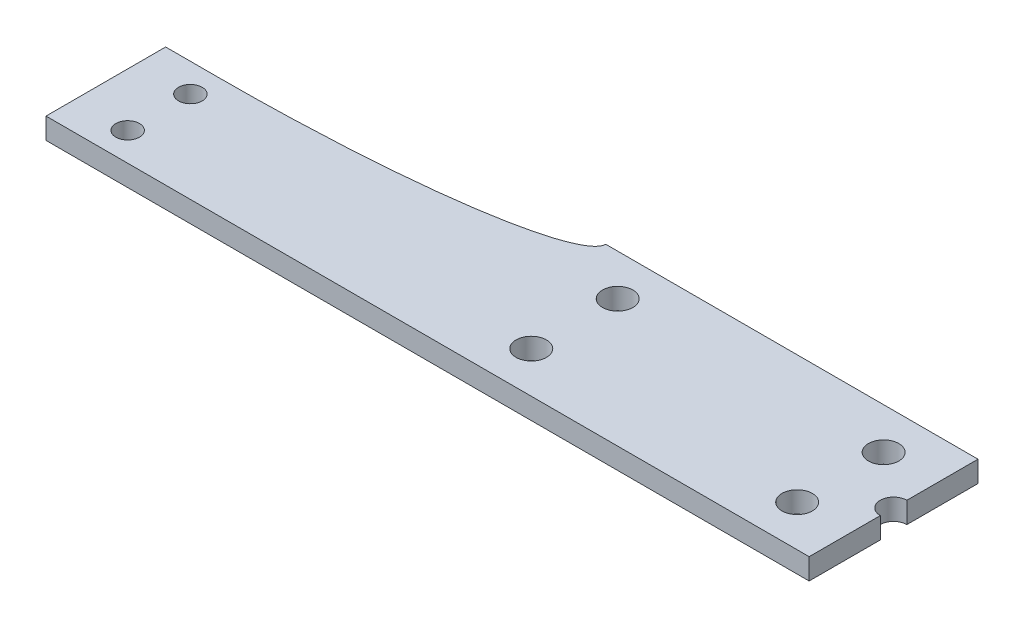
ISO-10303-21;
HEADER;
FILE_DESCRIPTION(('STEP AP214'),'2;1');
FILE_NAME('part.step','',(''),(''),'','','');
FILE_SCHEMA(('AUTOMOTIVE_DESIGN { 1 0 10303 214 1 1 1 1 }'));
ENDSEC;
DATA;
#1=APPLICATION_CONTEXT('core data for automotive mechanical design processes');
#2=APPLICATION_PROTOCOL_DEFINITION('international standard','automotive_design',2000,#1);
#3=PRODUCT_CONTEXT('',#1,'mechanical');
#4=PRODUCT('Part','Part','',(#3));
#5=PRODUCT_RELATED_PRODUCT_CATEGORY('part','',(#4));
#6=PRODUCT_DEFINITION_FORMATION('','',#4);
#7=PRODUCT_DEFINITION_CONTEXT('part definition',#1,'design');
#8=PRODUCT_DEFINITION('design','',#6,#7);
#9=PRODUCT_DEFINITION_SHAPE('','',#8);
#10=(LENGTH_UNIT() NAMED_UNIT(*) SI_UNIT(.MILLI.,.METRE.));
#11=(NAMED_UNIT(*) PLANE_ANGLE_UNIT() SI_UNIT($,.RADIAN.));
#12=(NAMED_UNIT(*) SI_UNIT($,.STERADIAN.) SOLID_ANGLE_UNIT());
#13=UNCERTAINTY_MEASURE_WITH_UNIT(LENGTH_MEASURE(1.E-05),#10,'distance_accuracy_value','');
#14=(GEOMETRIC_REPRESENTATION_CONTEXT(3) GLOBAL_UNCERTAINTY_ASSIGNED_CONTEXT((#13)) GLOBAL_UNIT_ASSIGNED_CONTEXT((#10,
#11,#12)) REPRESENTATION_CONTEXT('',''));
#15=CARTESIAN_POINT('',(0.,0.,0.));
#16=DIRECTION('',(0.,0.,1.));
#17=DIRECTION('',(1.,0.,0.));
#18=AXIS2_PLACEMENT_3D('',#15,#16,#17);
#19=CARTESIAN_POINT('',(-26.7,1.5875,-6.35));
#20=DIRECTION('',(0.,1.,0.));
#21=DIRECTION('',(0.,0.,1.));
#22=AXIS2_PLACEMENT_3D('',#19,#20,#21);
#23=PLANE('',#22);
#24=CARTESIAN_POINT('',(22.7,1.5875,-3.25));
#25=DIRECTION('',(0.,1.,0.));
#26=DIRECTION('',(0.,0.,1.));
#27=AXIS2_PLACEMENT_3D('',#24,#25,#26);
#28=CIRCLE('',#27,1.143);
#29=CARTESIAN_POINT('',(22.7,1.5875,-2.107));
#30=VERTEX_POINT('',#29);
#31=EDGE_CURVE('E338',#30,#30,#28,.T.);
#32=ORIENTED_EDGE('',*,*,#31,.F.);
#33=EDGE_LOOP('',(#32));
#34=FACE_BOUND('',#33,.T.);
#35=CARTESIAN_POINT('',(2.70000000000001,1.5875,-3.25));
#36=DIRECTION('',(0.,1.,0.));
#37=DIRECTION('',(0.,0.,1.));
#38=AXIS2_PLACEMENT_3D('',#35,#36,#37);
#39=CIRCLE('',#38,1.143);
#40=CARTESIAN_POINT('',(2.70000000000001,1.5875,-2.107));
#41=VERTEX_POINT('',#40);
#42=EDGE_CURVE('E350',#41,#41,#39,.T.);
#43=ORIENTED_EDGE('',*,*,#42,.F.);
#44=EDGE_LOOP('',(#43));
#45=FACE_BOUND('',#44,.T.);
#46=CARTESIAN_POINT('',(-26.7,1.5875,-0.509999999999998));
#47=DIRECTION('',(0.,1.,0.));
#48=DIRECTION('',(0.,0.,1.));
#49=AXIS2_PLACEMENT_3D('',#46,#47,#48);
#50=CIRCLE('',#49,0.89);
#51=CARTESIAN_POINT('',(-26.7,1.5875,0.380000000000002));
#52=VERTEX_POINT('',#51);
#53=EDGE_CURVE('E133',#52,#52,#50,.T.);
#54=ORIENTED_EDGE('',*,*,#53,.F.);
#55=EDGE_LOOP('',(#54));
#56=FACE_BOUND('',#55,.T.);
#57=DIRECTION('',(0.,0.,-1.));
#58=VECTOR('',#57,1.);
#59=CARTESIAN_POINT('',(26.7,1.5875,-0.999999999999999));
#60=LINE('',#59,#58);
#61=CARTESIAN_POINT('',(26.7,1.5875,-0.999999999999999));
#62=VERTEX_POINT('',#61);
#63=CARTESIAN_POINT('',(26.7,1.5875,-6.35));
#64=VERTEX_POINT('',#63);
#65=EDGE_CURVE('E145',#62,#64,#60,.T.);
#66=ORIENTED_EDGE('',*,*,#65,.T.);
#67=DIRECTION('',(-1.,0.,0.));
#68=VECTOR('',#67,1.);
#69=CARTESIAN_POINT('',(26.7,1.5875,-6.35));
#70=LINE('',#69,#68);
#71=CARTESIAN_POINT('',(-1.3,1.5875,-6.35));
#72=VERTEX_POINT('',#71);
#73=EDGE_CURVE('E93',#64,#72,#70,.T.);
#74=ORIENTED_EDGE('',*,*,#73,.T.);
#75=CARTESIAN_POINT('',(-26.7,1.5875,-6.35));
#76=DIRECTION('',(0.,-1.,0.));
#77=DIRECTION('',(1.,0.,0.));
#78=AXIS2_PLACEMENT_3D('',#75,#76,#77);
#79=ELLIPSE('',#78,25.4,3.7);
#80=CARTESIAN_POINT('',(-26.7,1.5875,-2.65));
#81=VERTEX_POINT('',#80);
#82=EDGE_CURVE('E160',#72,#81,#79,.T.);
#83=ORIENTED_EDGE('',*,*,#82,.T.);
#84=DIRECTION('',(-1.,0.,0.));
#85=VECTOR('',#84,1.);
#86=CARTESIAN_POINT('',(-30.7,1.5875,-2.65));
#87=LINE('',#86,#85);
#88=CARTESIAN_POINT('',(-30.7,1.5875,-2.65));
#89=VERTEX_POINT('',#88);
#90=EDGE_CURVE('E173',#81,#89,#87,.T.);
#91=ORIENTED_EDGE('',*,*,#90,.T.);
#92=DIRECTION('',(0.,0.,1.));
#93=VECTOR('',#92,1.);
#94=CARTESIAN_POINT('',(-30.7,1.5875,6.35));
#95=LINE('',#94,#93);
#96=CARTESIAN_POINT('',(-30.7,1.5875,6.35));
#97=VERTEX_POINT('',#96);
#98=EDGE_CURVE('E112',#89,#97,#95,.T.);
#99=ORIENTED_EDGE('',*,*,#98,.T.);
#100=DIRECTION('',(1.,0.,0.));
#101=VECTOR('',#100,1.);
#102=CARTESIAN_POINT('',(-26.7,1.5875,6.35));
#103=LINE('',#102,#101);
#104=CARTESIAN_POINT('',(26.7,1.5875,6.35));
#105=VERTEX_POINT('',#104);
#106=EDGE_CURVE('E106',#97,#105,#103,.T.);
#107=ORIENTED_EDGE('',*,*,#106,.T.);
#108=DIRECTION('',(0.,0.,-1.));
#109=VECTOR('',#108,1.);
#110=CARTESIAN_POINT('',(26.7,1.5875,6.35));
#111=LINE('',#110,#109);
#112=CARTESIAN_POINT('',(26.7,1.5875,1.));
#113=VERTEX_POINT('',#112);
#114=EDGE_CURVE('E110',#105,#113,#111,.T.);
#115=ORIENTED_EDGE('',*,*,#114,.T.);
#116=CARTESIAN_POINT('',(26.7,1.5875,0.));
#117=DIRECTION('',(0.,-1.,0.));
#118=DIRECTION('',(0.,0.,1.));
#119=AXIS2_PLACEMENT_3D('',#116,#117,#118);
#120=CIRCLE('',#119,1.);
#121=EDGE_CURVE('E50',#113,#62,#120,.T.);
#122=ORIENTED_EDGE('',*,*,#121,.T.);
#123=EDGE_LOOP('',(#66,#74,#83,#91,#99,#107,#115,#122));
#124=FACE_BOUND('',#123,.T.);
#125=CARTESIAN_POINT('',(-26.7,1.5875,4.21));
#126=DIRECTION('',(0.,1.,0.));
#127=DIRECTION('',(0.,0.,1.));
#128=AXIS2_PLACEMENT_3D('',#125,#126,#127);
#129=CIRCLE('',#128,0.89);
#130=CARTESIAN_POINT('',(-26.7,1.5875,5.1));
#131=VERTEX_POINT('',#130);
#132=EDGE_CURVE('E356',#131,#131,#129,.T.);
#133=ORIENTED_EDGE('',*,*,#132,.F.);
#134=EDGE_LOOP('',(#133));
#135=FACE_BOUND('',#134,.T.);
#136=CARTESIAN_POINT('',(2.70000000000001,1.5875,3.25));
#137=DIRECTION('',(0.,1.,0.));
#138=DIRECTION('',(0.,0.,1.));
#139=AXIS2_PLACEMENT_3D('',#136,#137,#138);
#140=CIRCLE('',#139,1.143);
#141=CARTESIAN_POINT('',(2.70000000000001,1.5875,4.393));
#142=VERTEX_POINT('',#141);
#143=EDGE_CURVE('E344',#142,#142,#140,.T.);
#144=ORIENTED_EDGE('',*,*,#143,.F.);
#145=EDGE_LOOP('',(#144));
#146=FACE_BOUND('',#145,.T.);
#147=CARTESIAN_POINT('',(22.7,1.5875,3.25));
#148=DIRECTION('',(0.,1.,0.));
#149=DIRECTION('',(0.,0.,1.));
#150=AXIS2_PLACEMENT_3D('',#147,#148,#149);
#151=CIRCLE('',#150,1.143);
#152=CARTESIAN_POINT('',(22.7,1.5875,4.393));
#153=VERTEX_POINT('',#152);
#154=EDGE_CURVE('E329',#153,#153,#151,.T.);
#155=ORIENTED_EDGE('',*,*,#154,.F.);
#156=EDGE_LOOP('',(#155));
#157=FACE_BOUND('',#156,.T.);
#158=ADVANCED_FACE('F33',(#34,#45,#56,#124,#135,#146,#157),#23,.T.);
#159=CARTESIAN_POINT('',(-26.7,0.,-6.35));
#160=DIRECTION('',(0.,1.,0.));
#161=DIRECTION('',(0.,0.,1.));
#162=AXIS2_PLACEMENT_3D('',#159,#160,#161);
#163=PLANE('',#162);
#164=DIRECTION('',(0.,0.,-1.));
#165=VECTOR('',#164,1.);
#166=CARTESIAN_POINT('',(26.7,0.,-0.999999999999999));
#167=LINE('',#166,#165);
#168=CARTESIAN_POINT('',(26.7,0.,-0.999999999999999));
#169=VERTEX_POINT('',#168);
#170=CARTESIAN_POINT('',(26.7,0.,-6.35));
#171=VERTEX_POINT('',#170);
#172=EDGE_CURVE('E129',#169,#171,#167,.T.);
#173=ORIENTED_EDGE('',*,*,#172,.F.);
#174=CARTESIAN_POINT('',(26.7,0.,0.));
#175=DIRECTION('',(0.,-1.,0.));
#176=DIRECTION('',(0.,0.,1.));
#177=AXIS2_PLACEMENT_3D('',#174,#175,#176);
#178=CIRCLE('',#177,1.);
#179=CARTESIAN_POINT('',(26.7,0.,1.));
#180=VERTEX_POINT('',#179);
#181=EDGE_CURVE('E85',#180,#169,#178,.T.);
#182=ORIENTED_EDGE('',*,*,#181,.F.);
#183=DIRECTION('',(0.,0.,-1.));
#184=VECTOR('',#183,1.);
#185=CARTESIAN_POINT('',(26.7,0.,6.35));
#186=LINE('',#185,#184);
#187=CARTESIAN_POINT('',(26.7,0.,6.35));
#188=VERTEX_POINT('',#187);
#189=EDGE_CURVE('E79',#188,#180,#186,.T.);
#190=ORIENTED_EDGE('',*,*,#189,.F.);
#191=DIRECTION('',(1.,0.,0.));
#192=VECTOR('',#191,1.);
#193=CARTESIAN_POINT('',(-26.7,0.,6.35));
#194=LINE('',#193,#192);
#195=CARTESIAN_POINT('',(-30.7,0.,6.35));
#196=VERTEX_POINT('',#195);
#197=EDGE_CURVE('E119',#196,#188,#194,.T.);
#198=ORIENTED_EDGE('',*,*,#197,.F.);
#199=DIRECTION('',(0.,0.,1.));
#200=VECTOR('',#199,1.);
#201=CARTESIAN_POINT('',(-30.7,0.,6.35));
#202=LINE('',#201,#200);
#203=CARTESIAN_POINT('',(-30.7,0.,-2.65));
#204=VERTEX_POINT('',#203);
#205=EDGE_CURVE('E139',#204,#196,#202,.T.);
#206=ORIENTED_EDGE('',*,*,#205,.F.);
#207=DIRECTION('',(-1.,0.,0.));
#208=VECTOR('',#207,1.);
#209=CARTESIAN_POINT('',(-30.7,0.,-2.65));
#210=LINE('',#209,#208);
#211=CARTESIAN_POINT('',(-26.7,0.,-2.65));
#212=VERTEX_POINT('',#211);
#213=EDGE_CURVE('E137',#212,#204,#210,.T.);
#214=ORIENTED_EDGE('',*,*,#213,.F.);
#215=CARTESIAN_POINT('',(-26.7,0.,-6.35));
#216=DIRECTION('',(0.,-1.,0.));
#217=DIRECTION('',(1.,0.,0.));
#218=AXIS2_PLACEMENT_3D('',#215,#216,#217);
#219=ELLIPSE('',#218,25.4,3.7);
#220=CARTESIAN_POINT('',(-1.3,0.,-6.35));
#221=VERTEX_POINT('',#220);
#222=EDGE_CURVE('E135',#221,#212,#219,.T.);
#223=ORIENTED_EDGE('',*,*,#222,.F.);
#224=DIRECTION('',(-1.,0.,0.));
#225=VECTOR('',#224,1.);
#226=CARTESIAN_POINT('',(26.7,0.,-6.35));
#227=LINE('',#226,#225);
#228=EDGE_CURVE('E132',#171,#221,#227,.T.);
#229=ORIENTED_EDGE('',*,*,#228,.F.);
#230=EDGE_LOOP('',(#173,#182,#190,#198,#206,#214,#223,#229));
#231=FACE_BOUND('',#230,.T.);
#232=CARTESIAN_POINT('',(-26.7,0.,-0.509999999999998));
#233=DIRECTION('',(0.,1.,0.));
#234=DIRECTION('',(0.,0.,1.));
#235=AXIS2_PLACEMENT_3D('',#232,#233,#234);
#236=CIRCLE('',#235,0.89);
#237=CARTESIAN_POINT('',(-26.7,0.,0.380000000000002));
#238=VERTEX_POINT('',#237);
#239=EDGE_CURVE('E359',#238,#238,#236,.T.);
#240=ORIENTED_EDGE('',*,*,#239,.T.);
#241=EDGE_LOOP('',(#240));
#242=FACE_BOUND('',#241,.T.);
#243=CARTESIAN_POINT('',(-26.7,0.,4.21));
#244=DIRECTION('',(0.,1.,0.));
#245=DIRECTION('',(0.,0.,1.));
#246=AXIS2_PLACEMENT_3D('',#243,#244,#245);
#247=CIRCLE('',#246,0.89);
#248=CARTESIAN_POINT('',(-26.7,0.,5.1));
#249=VERTEX_POINT('',#248);
#250=EDGE_CURVE('E353',#249,#249,#247,.T.);
#251=ORIENTED_EDGE('',*,*,#250,.T.);
#252=EDGE_LOOP('',(#251));
#253=FACE_BOUND('',#252,.T.);
#254=CARTESIAN_POINT('',(2.70000000000001,0.,-3.25));
#255=DIRECTION('',(0.,1.,0.));
#256=DIRECTION('',(0.,0.,1.));
#257=AXIS2_PLACEMENT_3D('',#254,#255,#256);
#258=CIRCLE('',#257,1.143);
#259=CARTESIAN_POINT('',(2.70000000000001,0.,-2.107));
#260=VERTEX_POINT('',#259);
#261=EDGE_CURVE('E347',#260,#260,#258,.T.);
#262=ORIENTED_EDGE('',*,*,#261,.T.);
#263=EDGE_LOOP('',(#262));
#264=FACE_BOUND('',#263,.T.);
#265=CARTESIAN_POINT('',(2.70000000000001,0.,3.25));
#266=DIRECTION('',(0.,1.,0.));
#267=DIRECTION('',(0.,0.,1.));
#268=AXIS2_PLACEMENT_3D('',#265,#266,#267);
#269=CIRCLE('',#268,1.143);
#270=CARTESIAN_POINT('',(2.70000000000001,0.,4.393));
#271=VERTEX_POINT('',#270);
#272=EDGE_CURVE('E341',#271,#271,#269,.T.);
#273=ORIENTED_EDGE('',*,*,#272,.T.);
#274=EDGE_LOOP('',(#273));
#275=FACE_BOUND('',#274,.T.);
#276=CARTESIAN_POINT('',(22.7,0.,-3.25));
#277=DIRECTION('',(0.,1.,0.));
#278=DIRECTION('',(0.,0.,1.));
#279=AXIS2_PLACEMENT_3D('',#276,#277,#278);
#280=CIRCLE('',#279,1.143);
#281=CARTESIAN_POINT('',(22.7,0.,-2.107));
#282=VERTEX_POINT('',#281);
#283=EDGE_CURVE('E335',#282,#282,#280,.T.);
#284=ORIENTED_EDGE('',*,*,#283,.T.);
#285=EDGE_LOOP('',(#284));
#286=FACE_BOUND('',#285,.T.);
#287=CARTESIAN_POINT('',(22.7,0.,3.25));
#288=DIRECTION('',(0.,1.,0.));
#289=DIRECTION('',(0.,0.,1.));
#290=AXIS2_PLACEMENT_3D('',#287,#288,#289);
#291=CIRCLE('',#290,1.143);
#292=CARTESIAN_POINT('',(22.7,0.,4.393));
#293=VERTEX_POINT('',#292);
#294=EDGE_CURVE('E332',#293,#293,#291,.T.);
#295=ORIENTED_EDGE('',*,*,#294,.T.);
#296=EDGE_LOOP('',(#295));
#297=FACE_BOUND('',#296,.T.);
#298=ADVANCED_FACE('F164',(#231,#242,#253,#264,#275,#286,#297),#163,.F.);
#299=CARTESIAN_POINT('',(26.7,1.5875,-0.999999999999999));
#300=DIRECTION('',(-1.,0.,0.));
#301=DIRECTION('',(0.,0.,1.));
#302=AXIS2_PLACEMENT_3D('',#299,#300,#301);
#303=PLANE('',#302);
#304=ORIENTED_EDGE('',*,*,#172,.T.);
#305=DIRECTION('',(0.,-1.,0.));
#306=VECTOR('',#305,1.);
#307=CARTESIAN_POINT('',(26.7,1.5875,-6.35));
#308=LINE('',#307,#306);
#309=EDGE_CURVE('E11',#64,#171,#308,.T.);
#310=ORIENTED_EDGE('',*,*,#309,.F.);
#311=ORIENTED_EDGE('',*,*,#65,.F.);
#312=DIRECTION('',(0.,-1.,0.));
#313=VECTOR('',#312,1.);
#314=CARTESIAN_POINT('',(26.7,1.5875,-0.999999999999999));
#315=LINE('',#314,#313);
#316=EDGE_CURVE('E125',#62,#169,#315,.T.);
#317=ORIENTED_EDGE('',*,*,#316,.T.);
#318=EDGE_LOOP('',(#304,#310,#311,#317));
#319=FACE_BOUND('',#318,.T.);
#320=ADVANCED_FACE('F35',(#319),#303,.F.);
#321=CARTESIAN_POINT('',(26.7,1.5875,-6.35));
#322=DIRECTION('',(0.,0.,1.));
#323=DIRECTION('',(1.,0.,0.));
#324=AXIS2_PLACEMENT_3D('',#321,#322,#323);
#325=PLANE('',#324);
#326=ORIENTED_EDGE('',*,*,#228,.T.);
#327=DIRECTION('',(0.,-1.,0.));
#328=VECTOR('',#327,1.);
#329=CARTESIAN_POINT('',(-1.3,1.5875,-6.35));
#330=LINE('',#329,#328);
#331=EDGE_CURVE('E42',#72,#221,#330,.T.);
#332=ORIENTED_EDGE('',*,*,#331,.F.);
#333=ORIENTED_EDGE('',*,*,#73,.F.);
#334=ORIENTED_EDGE('',*,*,#309,.T.);
#335=EDGE_LOOP('',(#326,#332,#333,#334));
#336=FACE_BOUND('',#335,.T.);
#337=ADVANCED_FACE('F182',(#336),#325,.F.);
#338=DIRECTION('',(0.,-1.,0.));
#339=VECTOR('',#338,1.);
#340=SURFACE_OF_LINEAR_EXTRUSION('',#79,#339);
#341=ORIENTED_EDGE('',*,*,#222,.T.);
#342=DIRECTION('',(0.,-1.,0.));
#343=VECTOR('',#342,1.);
#344=CARTESIAN_POINT('',(-26.7,1.5875,-2.65));
#345=LINE('',#344,#343);
#346=EDGE_CURVE('E152',#81,#212,#345,.T.);
#347=ORIENTED_EDGE('',*,*,#346,.F.);
#348=ORIENTED_EDGE('',*,*,#82,.F.);
#349=ORIENTED_EDGE('',*,*,#331,.T.);
#350=EDGE_LOOP('',(#341,#347,#348,#349));
#351=FACE_BOUND('',#350,.T.);
#352=ADVANCED_FACE('F158',(#351),#340,.F.);
#353=CARTESIAN_POINT('',(-30.7,1.5875,-2.65));
#354=DIRECTION('',(0.,0.,1.));
#355=DIRECTION('',(1.,0.,0.));
#356=AXIS2_PLACEMENT_3D('',#353,#354,#355);
#357=PLANE('',#356);
#358=ORIENTED_EDGE('',*,*,#213,.T.);
#359=DIRECTION('',(0.,-1.,0.));
#360=VECTOR('',#359,1.);
#361=CARTESIAN_POINT('',(-30.7,1.5875,-2.65));
#362=LINE('',#361,#360);
#363=EDGE_CURVE('E149',#89,#204,#362,.T.);
#364=ORIENTED_EDGE('',*,*,#363,.F.);
#365=ORIENTED_EDGE('',*,*,#90,.F.);
#366=ORIENTED_EDGE('',*,*,#346,.T.);
#367=EDGE_LOOP('',(#358,#364,#365,#366));
#368=FACE_BOUND('',#367,.T.);
#369=ADVANCED_FACE('F169',(#368),#357,.F.);
#370=CARTESIAN_POINT('',(-30.7,1.5875,6.35));
#371=DIRECTION('',(1.,0.,0.));
#372=DIRECTION('',(0.,0.,-1.));
#373=AXIS2_PLACEMENT_3D('',#370,#371,#372);
#374=PLANE('',#373);
#375=ORIENTED_EDGE('',*,*,#205,.T.);
#376=DIRECTION('',(0.,-1.,0.));
#377=VECTOR('',#376,1.);
#378=CARTESIAN_POINT('',(-30.7,1.5875,6.35));
#379=LINE('',#378,#377);
#380=EDGE_CURVE('E120',#97,#196,#379,.T.);
#381=ORIENTED_EDGE('',*,*,#380,.F.);
#382=ORIENTED_EDGE('',*,*,#98,.F.);
#383=ORIENTED_EDGE('',*,*,#363,.T.);
#384=EDGE_LOOP('',(#375,#381,#382,#383));
#385=FACE_BOUND('',#384,.T.);
#386=ADVANCED_FACE('F172',(#385),#374,.F.);
#387=CARTESIAN_POINT('',(-26.7,1.5875,6.35));
#388=DIRECTION('',(0.,0.,-1.));
#389=DIRECTION('',(-1.,0.,0.));
#390=AXIS2_PLACEMENT_3D('',#387,#388,#389);
#391=PLANE('',#390);
#392=ORIENTED_EDGE('',*,*,#197,.T.);
#393=DIRECTION('',(0.,-1.,0.));
#394=VECTOR('',#393,1.);
#395=CARTESIAN_POINT('',(26.7,1.5875,6.35));
#396=LINE('',#395,#394);
#397=EDGE_CURVE('E117',#105,#188,#396,.T.);
#398=ORIENTED_EDGE('',*,*,#397,.F.);
#399=ORIENTED_EDGE('',*,*,#106,.F.);
#400=ORIENTED_EDGE('',*,*,#380,.T.);
#401=EDGE_LOOP('',(#392,#398,#399,#400));
#402=FACE_BOUND('',#401,.T.);
#403=ADVANCED_FACE('F118',(#402),#391,.F.);
#404=CARTESIAN_POINT('',(26.7,1.5875,6.35));
#405=DIRECTION('',(-1.,0.,0.));
#406=DIRECTION('',(0.,0.,1.));
#407=AXIS2_PLACEMENT_3D('',#404,#405,#406);
#408=PLANE('',#407);
#409=ORIENTED_EDGE('',*,*,#189,.T.);
#410=DIRECTION('',(0.,-1.,0.));
#411=VECTOR('',#410,1.);
#412=CARTESIAN_POINT('',(26.7,1.5875,1.));
#413=LINE('',#412,#411);
#414=EDGE_CURVE('E121',#113,#180,#413,.T.);
#415=ORIENTED_EDGE('',*,*,#414,.F.);
#416=ORIENTED_EDGE('',*,*,#114,.F.);
#417=ORIENTED_EDGE('',*,*,#397,.T.);
#418=EDGE_LOOP('',(#409,#415,#416,#417));
#419=FACE_BOUND('',#418,.T.);
#420=ADVANCED_FACE('F123',(#419),#408,.F.);
#421=CARTESIAN_POINT('',(26.7,1.5875,0.));
#422=DIRECTION('',(0.,-1.,0.));
#423=DIRECTION('',(0.,0.,-1.));
#424=AXIS2_PLACEMENT_3D('',#421,#422,#423);
#425=CYLINDRICAL_SURFACE('',#424,1.);
#426=ORIENTED_EDGE('',*,*,#181,.T.);
#427=ORIENTED_EDGE('',*,*,#316,.F.);
#428=ORIENTED_EDGE('',*,*,#121,.F.);
#429=ORIENTED_EDGE('',*,*,#414,.T.);
#430=EDGE_LOOP('',(#426,#427,#428,#429));
#431=FACE_BOUND('',#430,.T.);
#432=ADVANCED_FACE('F202',(#431),#425,.F.);
#433=CARTESIAN_POINT('',(-26.7,1.5875,-0.509999999999998));
#434=DIRECTION('',(0.,-1.,0.));
#435=DIRECTION('',(0.,0.,-1.));
#436=AXIS2_PLACEMENT_3D('',#433,#434,#435);
#437=CYLINDRICAL_SURFACE('',#436,0.89);
#438=ORIENTED_EDGE('',*,*,#53,.T.);
#439=EDGE_LOOP('',(#438));
#440=FACE_BOUND('',#439,.T.);
#441=ORIENTED_EDGE('',*,*,#239,.F.);
#442=EDGE_LOOP('',(#441));
#443=FACE_BOUND('',#442,.T.);
#444=ADVANCED_FACE('F199',(#440,#443),#437,.F.);
#445=CARTESIAN_POINT('',(-26.7,1.5875,4.21));
#446=DIRECTION('',(0.,-1.,0.));
#447=DIRECTION('',(0.,0.,-1.));
#448=AXIS2_PLACEMENT_3D('',#445,#446,#447);
#449=CYLINDRICAL_SURFACE('',#448,0.89);
#450=ORIENTED_EDGE('',*,*,#132,.T.);
#451=EDGE_LOOP('',(#450));
#452=FACE_BOUND('',#451,.T.);
#453=ORIENTED_EDGE('',*,*,#250,.F.);
#454=EDGE_LOOP('',(#453));
#455=FACE_BOUND('',#454,.T.);
#456=ADVANCED_FACE('F272',(#452,#455),#449,.F.);
#457=CARTESIAN_POINT('',(2.70000000000001,1.5875,-3.25));
#458=DIRECTION('',(0.,-1.,0.));
#459=DIRECTION('',(0.,0.,-1.));
#460=AXIS2_PLACEMENT_3D('',#457,#458,#459);
#461=CYLINDRICAL_SURFACE('',#460,1.143);
#462=ORIENTED_EDGE('',*,*,#42,.T.);
#463=EDGE_LOOP('',(#462));
#464=FACE_BOUND('',#463,.T.);
#465=ORIENTED_EDGE('',*,*,#261,.F.);
#466=EDGE_LOOP('',(#465));
#467=FACE_BOUND('',#466,.T.);
#468=ADVANCED_FACE('F280',(#464,#467),#461,.F.);
#469=CARTESIAN_POINT('',(2.70000000000001,1.5875,3.25));
#470=DIRECTION('',(0.,-1.,0.));
#471=DIRECTION('',(0.,0.,-1.));
#472=AXIS2_PLACEMENT_3D('',#469,#470,#471);
#473=CYLINDRICAL_SURFACE('',#472,1.143);
#474=ORIENTED_EDGE('',*,*,#143,.T.);
#475=EDGE_LOOP('',(#474));
#476=FACE_BOUND('',#475,.T.);
#477=ORIENTED_EDGE('',*,*,#272,.F.);
#478=EDGE_LOOP('',(#477));
#479=FACE_BOUND('',#478,.T.);
#480=ADVANCED_FACE('F288',(#476,#479),#473,.F.);
#481=CARTESIAN_POINT('',(22.7,1.5875,-3.25));
#482=DIRECTION('',(0.,-1.,0.));
#483=DIRECTION('',(0.,0.,-1.));
#484=AXIS2_PLACEMENT_3D('',#481,#482,#483);
#485=CYLINDRICAL_SURFACE('',#484,1.143);
#486=ORIENTED_EDGE('',*,*,#31,.T.);
#487=EDGE_LOOP('',(#486));
#488=FACE_BOUND('',#487,.T.);
#489=ORIENTED_EDGE('',*,*,#283,.F.);
#490=EDGE_LOOP('',(#489));
#491=FACE_BOUND('',#490,.T.);
#492=ADVANCED_FACE('F297',(#488,#491),#485,.F.);
#493=CARTESIAN_POINT('',(22.7,1.5875,3.25));
#494=DIRECTION('',(0.,-1.,0.));
#495=DIRECTION('',(0.,0.,-1.));
#496=AXIS2_PLACEMENT_3D('',#493,#494,#495);
#497=CYLINDRICAL_SURFACE('',#496,1.143);
#498=ORIENTED_EDGE('',*,*,#154,.T.);
#499=EDGE_LOOP('',(#498));
#500=FACE_BOUND('',#499,.T.);
#501=ORIENTED_EDGE('',*,*,#294,.F.);
#502=EDGE_LOOP('',(#501));
#503=FACE_BOUND('',#502,.T.);
#504=ADVANCED_FACE('F306',(#500,#503),#497,.F.);
#505=CLOSED_SHELL('',(#158,#298,#320,#337,#352,#369,#386,#403,#420,#432,#444,#456,#468,#480,
#492,#504));
#506=MANIFOLD_SOLID_BREP('B2',#505);
#507=ADVANCED_BREP_SHAPE_REPRESENTATION('',(#18,#506),#14);
#508=SHAPE_DEFINITION_REPRESENTATION(#9,#507);
ENDSEC;
END-ISO-10303-21;
